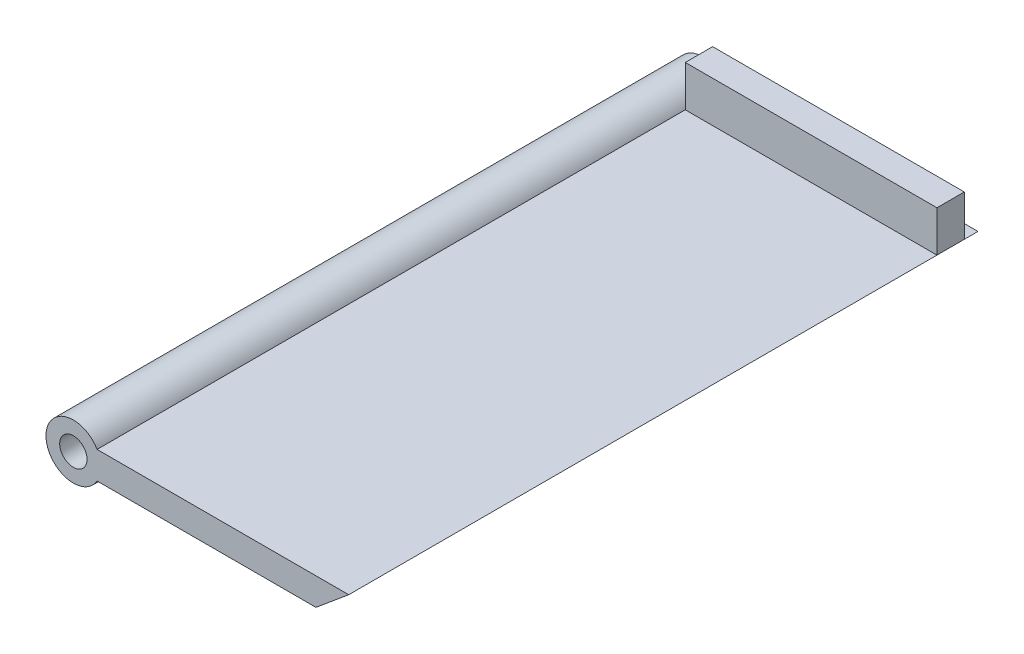
ISO-10303-21;
HEADER;
FILE_DESCRIPTION(('STEP AP214'),'2;1');
FILE_NAME('part.step','',(''),(''),'','','');
FILE_SCHEMA(('AUTOMOTIVE_DESIGN { 1 0 10303 214 1 1 1 1 }'));
ENDSEC;
DATA;
#1=APPLICATION_CONTEXT('core data for automotive mechanical design processes');
#2=APPLICATION_PROTOCOL_DEFINITION('international standard','automotive_design',2000,#1);
#3=PRODUCT_CONTEXT('',#1,'mechanical');
#4=PRODUCT('Part','Part','',(#3));
#5=PRODUCT_RELATED_PRODUCT_CATEGORY('part','',(#4));
#6=PRODUCT_DEFINITION_FORMATION('','',#4);
#7=PRODUCT_DEFINITION_CONTEXT('part definition',#1,'design');
#8=PRODUCT_DEFINITION('design','',#6,#7);
#9=PRODUCT_DEFINITION_SHAPE('','',#8);
#10=(LENGTH_UNIT() NAMED_UNIT(*) SI_UNIT(.MILLI.,.METRE.));
#11=(NAMED_UNIT(*) PLANE_ANGLE_UNIT() SI_UNIT($,.RADIAN.));
#12=(NAMED_UNIT(*) SI_UNIT($,.STERADIAN.) SOLID_ANGLE_UNIT());
#13=UNCERTAINTY_MEASURE_WITH_UNIT(LENGTH_MEASURE(1.E-05),#10,'distance_accuracy_value','');
#14=(GEOMETRIC_REPRESENTATION_CONTEXT(3) GLOBAL_UNCERTAINTY_ASSIGNED_CONTEXT((#13)) GLOBAL_UNIT_ASSIGNED_CONTEXT((#10,
#11,#12)) REPRESENTATION_CONTEXT('',''));
#15=CARTESIAN_POINT('',(0.,0.,0.));
#16=DIRECTION('',(0.,0.,1.));
#17=DIRECTION('',(1.,0.,0.));
#18=AXIS2_PLACEMENT_3D('',#15,#16,#17);
#19=CARTESIAN_POINT('',(-17.999931722497,3.05545519708178,146.05));
#20=DIRECTION('',(0.,-1.,0.));
#21=DIRECTION('',(0.,0.,-1.));
#22=AXIS2_PLACEMENT_3D('',#19,#20,#21);
#23=PLANE('',#22);
#24=DIRECTION('',(1.,0.,0.));
#25=VECTOR('',#24,1.);
#26=CARTESIAN_POINT('',(-17.999931722497,3.05545519708178,6.35));
#27=LINE('',#26,#25);
#28=CARTESIAN_POINT('',(-14.824931722497,3.05545519708178,6.35));
#29=VERTEX_POINT('',#28);
#30=CARTESIAN_POINT('',(37.2450682775029,3.05545519708178,6.35));
#31=VERTEX_POINT('',#30);
#32=EDGE_CURVE('E144',#29,#31,#27,.T.);
#33=ORIENTED_EDGE('',*,*,#32,.T.);
#34=DIRECTION('',(0.,0.,-1.));
#35=VECTOR('',#34,1.);
#36=CARTESIAN_POINT('',(37.245068277503,3.05545519708178,6.35));
#37=LINE('',#36,#35);
#38=CARTESIAN_POINT('',(37.245068277503,3.05545519708178,3.175));
#39=VERTEX_POINT('',#38);
#40=EDGE_CURVE('E213',#31,#39,#37,.T.);
#41=ORIENTED_EDGE('',*,*,#40,.T.);
#42=DIRECTION('',(1.,0.,0.));
#43=VECTOR('',#42,1.);
#44=CARTESIAN_POINT('',(0.,3.05545519708178,3.175));
#45=LINE('',#44,#43);
#46=CARTESIAN_POINT('',(40.420068277503,3.05545519708178,3.17500000000001));
#47=VERTEX_POINT('',#46);
#48=EDGE_CURVE('E55',#39,#47,#45,.T.);
#49=ORIENTED_EDGE('',*,*,#48,.T.);
#50=DIRECTION('',(0.,0.,-1.));
#51=VECTOR('',#50,1.);
#52=CARTESIAN_POINT('',(40.420068277503,3.05545519708178,146.05));
#53=LINE('',#52,#51);
#54=CARTESIAN_POINT('',(40.420068277503,3.05545519708178,0.));
#55=VERTEX_POINT('',#54);
#56=EDGE_CURVE('E161',#47,#55,#53,.T.);
#57=ORIENTED_EDGE('',*,*,#56,.T.);
#58=DIRECTION('',(-1.,0.,0.));
#59=VECTOR('',#58,1.);
#60=CARTESIAN_POINT('',(-17.999931722497,3.05545519708178,0.));
#61=LINE('',#60,#59);
#62=CARTESIAN_POINT('',(-17.999931722497,3.05545519708178,0.));
#63=VERTEX_POINT('',#62);
#64=EDGE_CURVE('E167',#55,#63,#61,.T.);
#65=ORIENTED_EDGE('',*,*,#64,.T.);
#66=DIRECTION('',(0.,0.,-1.));
#67=VECTOR('',#66,1.);
#68=CARTESIAN_POINT('',(-17.999931722497,3.05545519708178,146.05));
#69=LINE('',#68,#67);
#70=CARTESIAN_POINT('',(-17.999931722497,3.05545519708178,3.175));
#71=VERTEX_POINT('',#70);
#72=EDGE_CURVE('E162',#71,#63,#69,.T.);
#73=ORIENTED_EDGE('',*,*,#72,.F.);
#74=CARTESIAN_POINT('',(-14.824931722497,3.05545519708178,3.17500000000001));
#75=VERTEX_POINT('',#74);
#76=EDGE_CURVE('E48',#71,#75,#45,.T.);
#77=ORIENTED_EDGE('',*,*,#76,.T.);
#78=DIRECTION('',(0.,0.,-1.));
#79=VECTOR('',#78,1.);
#80=CARTESIAN_POINT('',(-14.824931722497,3.05545519708178,6.35));
#81=LINE('',#80,#79);
#82=EDGE_CURVE('E132',#29,#75,#81,.T.);
#83=ORIENTED_EDGE('',*,*,#82,.F.);
#84=EDGE_LOOP('',(#33,#41,#49,#57,#65,#73,#77,#83));
#85=FACE_BOUND('',#84,.T.);
#86=ADVANCED_FACE('F33',(#85),#23,.F.);
#87=CARTESIAN_POINT('',(-23.4991930365282,-0.119544802918222,146.05));
#88=DIRECTION('',(0.,0.,1.));
#89=DIRECTION('',(1.,0.,0.));
#90=AXIS2_PLACEMENT_3D('',#87,#88,#89);
#91=PLANE('',#90);
#92=CARTESIAN_POINT('',(-23.4991930365282,-0.119544802918222,146.05));
#93=DIRECTION('',(0.,0.,1.));
#94=DIRECTION('',(1.,0.,0.));
#95=AXIS2_PLACEMENT_3D('',#92,#93,#94);
#96=CIRCLE('',#95,6.35);
#97=CARTESIAN_POINT('',(-17.999931722497,3.05545519708178,146.05));
#98=VERTEX_POINT('',#97);
#99=CARTESIAN_POINT('',(-17.999931722497,-3.29454480291822,146.05));
#100=VERTEX_POINT('',#99);
#101=EDGE_CURVE('E160',#98,#100,#96,.T.);
#102=ORIENTED_EDGE('',*,*,#101,.T.);
#103=DIRECTION('',(1.,0.,0.));
#104=VECTOR('',#103,1.);
#105=CARTESIAN_POINT('',(-17.999931722497,-3.29454480291822,146.05));
#106=LINE('',#105,#104);
#107=CARTESIAN_POINT('',(32.800068277503,-3.29454480291822,146.05));
#108=VERTEX_POINT('',#107);
#109=EDGE_CURVE('E193',#100,#108,#106,.T.);
#110=ORIENTED_EDGE('',*,*,#109,.T.);
#111=DIRECTION('',(0.768221279597376,0.64018439966448,0.));
#112=VECTOR('',#111,1.);
#113=CARTESIAN_POINT('',(40.420068277503,3.05545519708178,146.05));
#114=LINE('',#113,#112);
#115=CARTESIAN_POINT('',(40.420068277503,3.05545519708178,146.05));
#116=VERTEX_POINT('',#115);
#117=EDGE_CURVE('E178',#108,#116,#114,.T.);
#118=ORIENTED_EDGE('',*,*,#117,.T.);
#119=DIRECTION('',(-1.,0.,0.));
#120=VECTOR('',#119,1.);
#121=CARTESIAN_POINT('',(-17.999931722497,3.05545519708178,146.05));
#122=LINE('',#121,#120);
#123=EDGE_CURVE('E165',#116,#98,#122,.T.);
#124=ORIENTED_EDGE('',*,*,#123,.T.);
#125=EDGE_LOOP('',(#102,#110,#118,#124));
#126=FACE_BOUND('',#125,.T.);
#127=CARTESIAN_POINT('',(-23.4991930365282,-0.119544802918222,146.05));
#128=DIRECTION('',(0.,0.,1.));
#129=DIRECTION('',(1.,0.,0.));
#130=AXIS2_PLACEMENT_3D('',#127,#128,#129);
#131=CIRCLE('',#130,3.175);
#132=CARTESIAN_POINT('',(-20.3241930365282,-0.119544802918222,146.05));
#133=VERTEX_POINT('',#132);
#134=EDGE_CURVE('E190',#133,#133,#131,.T.);
#135=ORIENTED_EDGE('',*,*,#134,.F.);
#136=EDGE_LOOP('',(#135));
#137=FACE_BOUND('',#136,.T.);
#138=ADVANCED_FACE('F262',(#126,#137),#91,.T.);
#139=CARTESIAN_POINT('',(-23.4991930365282,-0.119544802918222,0.));
#140=DIRECTION('',(0.,0.,1.));
#141=DIRECTION('',(1.,0.,0.));
#142=AXIS2_PLACEMENT_3D('',#139,#140,#141);
#143=PLANE('',#142);
#144=CARTESIAN_POINT('',(-23.4991930365282,-0.119544802918222,0.));
#145=DIRECTION('',(0.,0.,1.));
#146=DIRECTION('',(1.,0.,0.));
#147=AXIS2_PLACEMENT_3D('',#144,#145,#146);
#148=CIRCLE('',#147,6.35);
#149=CARTESIAN_POINT('',(-17.999931722497,-3.29454480291822,0.));
#150=VERTEX_POINT('',#149);
#151=EDGE_CURVE('E186',#63,#150,#148,.T.);
#152=ORIENTED_EDGE('',*,*,#151,.F.);
#153=ORIENTED_EDGE('',*,*,#64,.F.);
#154=DIRECTION('',(0.768221279597376,0.64018439966448,0.));
#155=VECTOR('',#154,1.);
#156=CARTESIAN_POINT('',(40.420068277503,3.05545519708178,0.));
#157=LINE('',#156,#155);
#158=CARTESIAN_POINT('',(32.800068277503,-3.29454480291822,0.));
#159=VERTEX_POINT('',#158);
#160=EDGE_CURVE('E176',#159,#55,#157,.T.);
#161=ORIENTED_EDGE('',*,*,#160,.F.);
#162=DIRECTION('',(1.,0.,0.));
#163=VECTOR('',#162,1.);
#164=CARTESIAN_POINT('',(-17.999931722497,-3.29454480291822,0.));
#165=LINE('',#164,#163);
#166=EDGE_CURVE('E184',#150,#159,#165,.T.);
#167=ORIENTED_EDGE('',*,*,#166,.F.);
#168=EDGE_LOOP('',(#152,#153,#161,#167));
#169=FACE_BOUND('',#168,.T.);
#170=CARTESIAN_POINT('',(-23.4991930365282,-0.119544802918222,0.));
#171=DIRECTION('',(0.,0.,1.));
#172=DIRECTION('',(1.,0.,0.));
#173=AXIS2_PLACEMENT_3D('',#170,#171,#172);
#174=CIRCLE('',#173,3.175);
#175=CARTESIAN_POINT('',(-20.3241930365282,-0.119544802918222,0.));
#176=VERTEX_POINT('',#175);
#177=EDGE_CURVE('E196',#176,#176,#174,.T.);
#178=ORIENTED_EDGE('',*,*,#177,.T.);
#179=EDGE_LOOP('',(#178));
#180=FACE_BOUND('',#179,.T.);
#181=ADVANCED_FACE('F182',(#169,#180),#143,.F.);
#182=CARTESIAN_POINT('',(-23.4991930365282,-0.119544802918222,146.05));
#183=DIRECTION('',(0.,0.,-1.));
#184=DIRECTION('',(-1.,0.,0.));
#185=AXIS2_PLACEMENT_3D('',#182,#183,#184);
#186=CYLINDRICAL_SURFACE('',#185,6.35);
#187=ORIENTED_EDGE('',*,*,#151,.T.);
#188=DIRECTION('',(0.,0.,-1.));
#189=VECTOR('',#188,1.);
#190=CARTESIAN_POINT('',(-17.999931722497,-3.29454480291822,146.05));
#191=LINE('',#190,#189);
#192=EDGE_CURVE('E11',#100,#150,#191,.T.);
#193=ORIENTED_EDGE('',*,*,#192,.F.);
#194=ORIENTED_EDGE('',*,*,#101,.F.);
#195=CARTESIAN_POINT('',(-17.999931722497,3.05545519708178,9.525));
#196=VERTEX_POINT('',#195);
#197=EDGE_CURVE('E151',#98,#196,#69,.T.);
#198=ORIENTED_EDGE('',*,*,#197,.T.);
#199=DIRECTION('',(0.,0.,-1.));
#200=VECTOR('',#199,1.);
#201=CARTESIAN_POINT('',(-17.999931722497,3.05545519708178,6.35));
#202=LINE('',#201,#200);
#203=EDGE_CURVE('E123',#196,#71,#202,.T.);
#204=ORIENTED_EDGE('',*,*,#203,.T.);
#205=ORIENTED_EDGE('',*,*,#72,.T.);
#206=EDGE_LOOP('',(#187,#193,#194,#198,#204,#205));
#207=FACE_BOUND('',#206,.T.);
#208=ADVANCED_FACE('F35',(#207),#186,.T.);
#209=CARTESIAN_POINT('',(-17.999931722497,-3.29454480291822,146.05));
#210=DIRECTION('',(0.,1.,0.));
#211=DIRECTION('',(0.,0.,1.));
#212=AXIS2_PLACEMENT_3D('',#209,#210,#211);
#213=PLANE('',#212);
#214=ORIENTED_EDGE('',*,*,#166,.T.);
#215=DIRECTION('',(0.,0.,-1.));
#216=VECTOR('',#215,1.);
#217=CARTESIAN_POINT('',(32.800068277503,-3.29454480291822,146.05));
#218=LINE('',#217,#216);
#219=EDGE_CURVE('E41',#108,#159,#218,.T.);
#220=ORIENTED_EDGE('',*,*,#219,.F.);
#221=ORIENTED_EDGE('',*,*,#109,.F.);
#222=ORIENTED_EDGE('',*,*,#192,.T.);
#223=EDGE_LOOP('',(#214,#220,#221,#222));
#224=FACE_BOUND('',#223,.T.);
#225=ADVANCED_FACE('F280',(#224),#213,.F.);
#226=CARTESIAN_POINT('',(40.420068277503,3.05545519708178,146.05));
#227=DIRECTION('',(-0.64018439966448,0.768221279597376,0.));
#228=DIRECTION('',(-0.768221279597376,-0.64018439966448,0.));
#229=AXIS2_PLACEMENT_3D('',#226,#227,#228);
#230=PLANE('',#229);
#231=ORIENTED_EDGE('',*,*,#160,.T.);
#232=ORIENTED_EDGE('',*,*,#56,.F.);
#233=DIRECTION('',(0.,0.,-1.));
#234=VECTOR('',#233,1.);
#235=CARTESIAN_POINT('',(40.420068277503,3.05545519708178,6.35));
#236=LINE('',#235,#234);
#237=CARTESIAN_POINT('',(40.420068277503,3.05545519708178,9.525));
#238=VERTEX_POINT('',#237);
#239=EDGE_CURVE('E199',#238,#47,#236,.T.);
#240=ORIENTED_EDGE('',*,*,#239,.F.);
#241=EDGE_CURVE('E154',#116,#238,#53,.T.);
#242=ORIENTED_EDGE('',*,*,#241,.F.);
#243=ORIENTED_EDGE('',*,*,#117,.F.);
#244=ORIENTED_EDGE('',*,*,#219,.T.);
#245=EDGE_LOOP('',(#231,#232,#240,#242,#243,#244));
#246=FACE_BOUND('',#245,.T.);
#247=ADVANCED_FACE('F175',(#246),#230,.F.);
#248=ORIENTED_EDGE('',*,*,#241,.T.);
#249=DIRECTION('',(1.,0.,0.));
#250=VECTOR('',#249,1.);
#251=CARTESIAN_POINT('',(-17.999931722497,3.05545519708178,9.525));
#252=LINE('',#251,#250);
#253=EDGE_CURVE('E140',#196,#238,#252,.T.);
#254=ORIENTED_EDGE('',*,*,#253,.F.);
#255=ORIENTED_EDGE('',*,*,#197,.F.);
#256=ORIENTED_EDGE('',*,*,#123,.F.);
#257=EDGE_LOOP('',(#248,#254,#255,#256));
#258=FACE_BOUND('',#257,.T.);
#259=ADVANCED_FACE('F149',(#258),#23,.F.);
#260=CARTESIAN_POINT('',(-23.4991930365282,-0.119544802918222,146.05));
#261=DIRECTION('',(0.,0.,-1.));
#262=DIRECTION('',(-1.,0.,0.));
#263=AXIS2_PLACEMENT_3D('',#260,#261,#262);
#264=CYLINDRICAL_SURFACE('',#263,3.175);
#265=ORIENTED_EDGE('',*,*,#134,.T.);
#266=EDGE_LOOP('',(#265));
#267=FACE_BOUND('',#266,.T.);
#268=ORIENTED_EDGE('',*,*,#177,.F.);
#269=EDGE_LOOP('',(#268));
#270=FACE_BOUND('',#269,.T.);
#271=ADVANCED_FACE('F272',(#267,#270),#264,.F.);
#272=CARTESIAN_POINT('',(40.420068277503,0.,6.35));
#273=DIRECTION('',(-1.,0.,0.));
#274=DIRECTION('',(0.,0.,1.));
#275=AXIS2_PLACEMENT_3D('',#272,#273,#274);
#276=PLANE('',#275);
#277=DIRECTION('',(0.,1.,0.));
#278=VECTOR('',#277,1.);
#279=CARTESIAN_POINT('',(40.420068277503,0.,3.175));
#280=LINE('',#279,#278);
#281=CARTESIAN_POINT('',(40.420068277503,12.5804551970818,3.175));
#282=VERTEX_POINT('',#281);
#283=EDGE_CURVE('E229',#47,#282,#280,.T.);
#284=ORIENTED_EDGE('',*,*,#283,.T.);
#285=DIRECTION('',(0.,0.,-1.));
#286=VECTOR('',#285,1.);
#287=CARTESIAN_POINT('',(40.420068277503,12.5804551970818,6.35));
#288=LINE('',#287,#286);
#289=CARTESIAN_POINT('',(40.420068277503,12.5804551970818,9.525));
#290=VERTEX_POINT('',#289);
#291=EDGE_CURVE('E204',#290,#282,#288,.T.);
#292=ORIENTED_EDGE('',*,*,#291,.F.);
#293=DIRECTION('',(0.,1.,0.));
#294=VECTOR('',#293,1.);
#295=CARTESIAN_POINT('',(40.420068277503,12.5804551970818,9.525));
#296=LINE('',#295,#294);
#297=EDGE_CURVE('E155',#238,#290,#296,.T.);
#298=ORIENTED_EDGE('',*,*,#297,.F.);
#299=ORIENTED_EDGE('',*,*,#239,.T.);
#300=EDGE_LOOP('',(#284,#292,#298,#299));
#301=FACE_BOUND('',#300,.T.);
#302=ADVANCED_FACE('F277',(#301),#276,.F.);
#303=CARTESIAN_POINT('',(0.,12.5804551970818,6.35));
#304=DIRECTION('',(0.,1.,0.));
#305=DIRECTION('',(0.,0.,1.));
#306=AXIS2_PLACEMENT_3D('',#303,#304,#305);
#307=PLANE('',#306);
#308=DIRECTION('',(1.,0.,0.));
#309=VECTOR('',#308,1.);
#310=CARTESIAN_POINT('',(0.,12.5804551970818,3.175));
#311=LINE('',#310,#309);
#312=CARTESIAN_POINT('',(-17.999931722497,12.5804551970818,3.175));
#313=VERTEX_POINT('',#312);
#314=EDGE_CURVE('E226',#313,#282,#311,.T.);
#315=ORIENTED_EDGE('',*,*,#314,.F.);
#316=DIRECTION('',(0.,0.,-1.));
#317=VECTOR('',#316,1.);
#318=CARTESIAN_POINT('',(-17.999931722497,12.5804551970818,6.35));
#319=LINE('',#318,#317);
#320=CARTESIAN_POINT('',(-17.999931722497,12.5804551970818,9.525));
#321=VERTEX_POINT('',#320);
#322=EDGE_CURVE('E131',#321,#313,#319,.T.);
#323=ORIENTED_EDGE('',*,*,#322,.F.);
#324=DIRECTION('',(-1.,0.,0.));
#325=VECTOR('',#324,1.);
#326=CARTESIAN_POINT('',(-17.999931722497,12.5804551970818,9.525));
#327=LINE('',#326,#325);
#328=EDGE_CURVE('E143',#290,#321,#327,.T.);
#329=ORIENTED_EDGE('',*,*,#328,.F.);
#330=ORIENTED_EDGE('',*,*,#291,.T.);
#331=EDGE_LOOP('',(#315,#323,#329,#330));
#332=FACE_BOUND('',#331,.T.);
#333=ADVANCED_FACE('F244',(#332),#307,.T.);
#334=CARTESIAN_POINT('',(-17.999931722497,0.,6.35));
#335=DIRECTION('',(-1.,0.,0.));
#336=DIRECTION('',(0.,0.,1.));
#337=AXIS2_PLACEMENT_3D('',#334,#335,#336);
#338=PLANE('',#337);
#339=DIRECTION('',(0.,1.,0.));
#340=VECTOR('',#339,1.);
#341=CARTESIAN_POINT('',(-17.999931722497,0.,3.175));
#342=LINE('',#341,#340);
#343=EDGE_CURVE('E128',#71,#313,#342,.T.);
#344=ORIENTED_EDGE('',*,*,#343,.F.);
#345=ORIENTED_EDGE('',*,*,#203,.F.);
#346=DIRECTION('',(0.,-1.,0.));
#347=VECTOR('',#346,1.);
#348=CARTESIAN_POINT('',(-17.999931722497,12.5804551970818,9.525));
#349=LINE('',#348,#347);
#350=EDGE_CURVE('E126',#321,#196,#349,.T.);
#351=ORIENTED_EDGE('',*,*,#350,.F.);
#352=ORIENTED_EDGE('',*,*,#322,.T.);
#353=EDGE_LOOP('',(#344,#345,#351,#352));
#354=FACE_BOUND('',#353,.T.);
#355=ADVANCED_FACE('F125',(#354),#338,.T.);
#356=CARTESIAN_POINT('',(-14.824931722497,0.,6.35));
#357=DIRECTION('',(-1.,0.,0.));
#358=DIRECTION('',(0.,-1.,0.));
#359=AXIS2_PLACEMENT_3D('',#356,#357,#358);
#360=PLANE('',#359);
#361=DIRECTION('',(0.,1.,0.));
#362=VECTOR('',#361,1.);
#363=CARTESIAN_POINT('',(-14.824931722497,0.,3.175));
#364=LINE('',#363,#362);
#365=CARTESIAN_POINT('',(-14.824931722497,9.40545519708178,3.175));
#366=VERTEX_POINT('',#365);
#367=EDGE_CURVE('E223',#75,#366,#364,.T.);
#368=ORIENTED_EDGE('',*,*,#367,.T.);
#369=DIRECTION('',(0.,0.,-1.));
#370=VECTOR('',#369,1.);
#371=CARTESIAN_POINT('',(-14.824931722497,9.40545519708178,6.35));
#372=LINE('',#371,#370);
#373=CARTESIAN_POINT('',(-14.824931722497,9.40545519708178,6.35));
#374=VERTEX_POINT('',#373);
#375=EDGE_CURVE('E208',#374,#366,#372,.T.);
#376=ORIENTED_EDGE('',*,*,#375,.F.);
#377=DIRECTION('',(0.,1.,0.));
#378=VECTOR('',#377,1.);
#379=CARTESIAN_POINT('',(-14.824931722497,0.,6.35));
#380=LINE('',#379,#378);
#381=EDGE_CURVE('E219',#29,#374,#380,.T.);
#382=ORIENTED_EDGE('',*,*,#381,.F.);
#383=ORIENTED_EDGE('',*,*,#82,.T.);
#384=EDGE_LOOP('',(#368,#376,#382,#383));
#385=FACE_BOUND('',#384,.T.);
#386=ADVANCED_FACE('F252',(#385),#360,.F.);
#387=CARTESIAN_POINT('',(0.,9.40545519708178,6.35));
#388=DIRECTION('',(0.,1.,0.));
#389=DIRECTION('',(0.,0.,1.));
#390=AXIS2_PLACEMENT_3D('',#387,#388,#389);
#391=PLANE('',#390);
#392=DIRECTION('',(1.,0.,0.));
#393=VECTOR('',#392,1.);
#394=CARTESIAN_POINT('',(0.,9.40545519708178,3.175));
#395=LINE('',#394,#393);
#396=CARTESIAN_POINT('',(37.245068277503,9.40545519708178,3.175));
#397=VERTEX_POINT('',#396);
#398=EDGE_CURVE('E220',#366,#397,#395,.T.);
#399=ORIENTED_EDGE('',*,*,#398,.T.);
#400=DIRECTION('',(0.,0.,-1.));
#401=VECTOR('',#400,1.);
#402=CARTESIAN_POINT('',(37.245068277503,9.40545519708178,6.35));
#403=LINE('',#402,#401);
#404=CARTESIAN_POINT('',(37.245068277503,9.40545519708178,6.35));
#405=VERTEX_POINT('',#404);
#406=EDGE_CURVE('E211',#405,#397,#403,.T.);
#407=ORIENTED_EDGE('',*,*,#406,.F.);
#408=DIRECTION('',(1.,0.,0.));
#409=VECTOR('',#408,1.);
#410=CARTESIAN_POINT('',(0.,9.40545519708178,6.35));
#411=LINE('',#410,#409);
#412=EDGE_CURVE('E235',#374,#405,#411,.T.);
#413=ORIENTED_EDGE('',*,*,#412,.F.);
#414=ORIENTED_EDGE('',*,*,#375,.T.);
#415=EDGE_LOOP('',(#399,#407,#413,#414));
#416=FACE_BOUND('',#415,.T.);
#417=ADVANCED_FACE('F256',(#416),#391,.F.);
#418=CARTESIAN_POINT('',(37.245068277503,0.,6.35));
#419=DIRECTION('',(-1.,0.,0.));
#420=DIRECTION('',(0.,0.,1.));
#421=AXIS2_PLACEMENT_3D('',#418,#419,#420);
#422=PLANE('',#421);
#423=DIRECTION('',(0.,1.,0.));
#424=VECTOR('',#423,1.);
#425=CARTESIAN_POINT('',(37.245068277503,0.,3.175));
#426=LINE('',#425,#424);
#427=EDGE_CURVE('E216',#39,#397,#426,.T.);
#428=ORIENTED_EDGE('',*,*,#427,.F.);
#429=ORIENTED_EDGE('',*,*,#40,.F.);
#430=DIRECTION('',(0.,1.,0.));
#431=VECTOR('',#430,1.);
#432=CARTESIAN_POINT('',(37.245068277503,0.,6.35));
#433=LINE('',#432,#431);
#434=EDGE_CURVE('E215',#31,#405,#433,.T.);
#435=ORIENTED_EDGE('',*,*,#434,.T.);
#436=ORIENTED_EDGE('',*,*,#406,.T.);
#437=EDGE_LOOP('',(#428,#429,#435,#436));
#438=FACE_BOUND('',#437,.T.);
#439=ADVANCED_FACE('F355',(#438),#422,.T.);
#440=CARTESIAN_POINT('',(0.,0.,3.175));
#441=DIRECTION('',(0.,0.,1.));
#442=DIRECTION('',(1.,0.,0.));
#443=AXIS2_PLACEMENT_3D('',#440,#441,#442);
#444=PLANE('',#443);
#445=ORIENTED_EDGE('',*,*,#48,.F.);
#446=ORIENTED_EDGE('',*,*,#427,.T.);
#447=ORIENTED_EDGE('',*,*,#398,.F.);
#448=ORIENTED_EDGE('',*,*,#367,.F.);
#449=ORIENTED_EDGE('',*,*,#76,.F.);
#450=ORIENTED_EDGE('',*,*,#343,.T.);
#451=ORIENTED_EDGE('',*,*,#314,.T.);
#452=ORIENTED_EDGE('',*,*,#283,.F.);
#453=EDGE_LOOP('',(#445,#446,#447,#448,#449,#450,#451,#452));
#454=FACE_BOUND('',#453,.T.);
#455=ADVANCED_FACE('F247',(#454),#444,.F.);
#456=CARTESIAN_POINT('',(0.,0.,9.525));
#457=DIRECTION('',(0.,0.,1.));
#458=DIRECTION('',(1.,0.,0.));
#459=AXIS2_PLACEMENT_3D('',#456,#457,#458);
#460=PLANE('',#459);
#461=ORIENTED_EDGE('',*,*,#350,.T.);
#462=ORIENTED_EDGE('',*,*,#253,.T.);
#463=ORIENTED_EDGE('',*,*,#297,.T.);
#464=ORIENTED_EDGE('',*,*,#328,.T.);
#465=EDGE_LOOP('',(#461,#462,#463,#464));
#466=FACE_BOUND('',#465,.T.);
#467=ADVANCED_FACE('F138',(#466),#460,.T.);
#468=CARTESIAN_POINT('',(0.,0.,6.35));
#469=DIRECTION('',(0.,0.,1.));
#470=DIRECTION('',(1.,0.,0.));
#471=AXIS2_PLACEMENT_3D('',#468,#469,#470);
#472=PLANE('',#471);
#473=ORIENTED_EDGE('',*,*,#32,.F.);
#474=ORIENTED_EDGE('',*,*,#381,.T.);
#475=ORIENTED_EDGE('',*,*,#412,.T.);
#476=ORIENTED_EDGE('',*,*,#434,.F.);
#477=EDGE_LOOP('',(#473,#474,#475,#476));
#478=FACE_BOUND('',#477,.T.);
#479=ADVANCED_FACE('F259',(#478),#472,.F.);
#480=CLOSED_SHELL('',(#86,#138,#181,#208,#225,#247,#259,#271,#302,#333,#355,#386,#417,#439,#455,
#467,#479));
#481=MANIFOLD_SOLID_BREP('B2',#480);
#482=ADVANCED_BREP_SHAPE_REPRESENTATION('',(#18,#481),#14);
#483=SHAPE_DEFINITION_REPRESENTATION(#9,#482);
ENDSEC;
END-ISO-10303-21;
